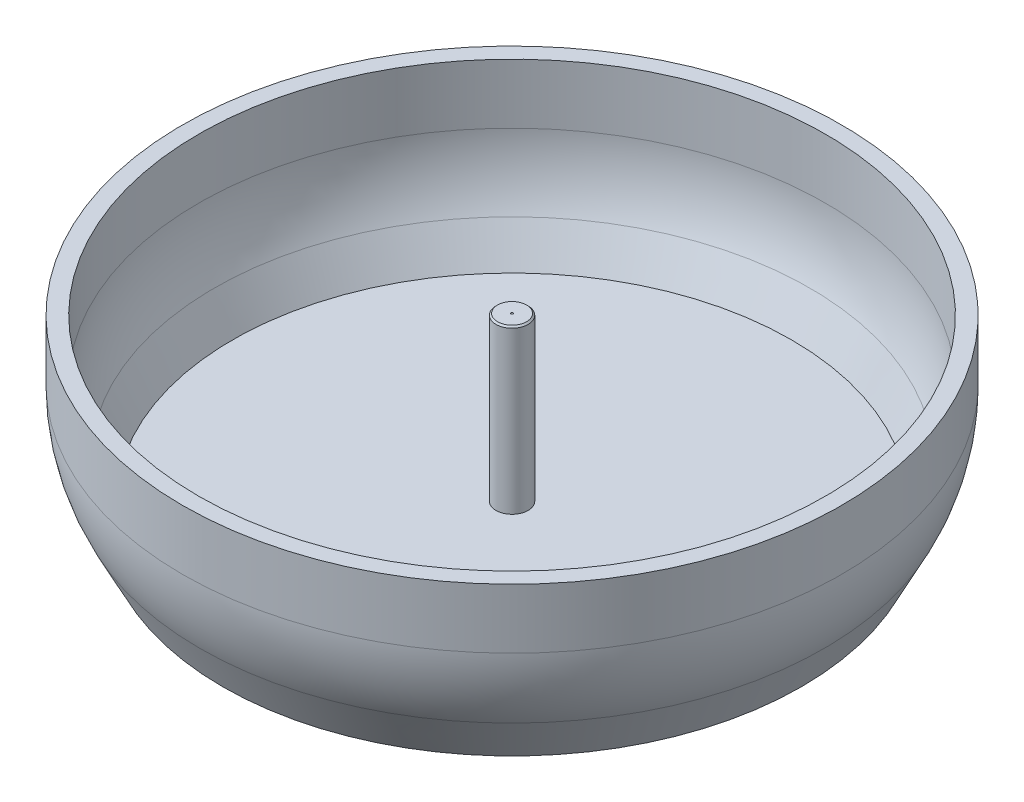
ISO-10303-21;
HEADER;
FILE_DESCRIPTION(('STEP AP214'),'2;1');
FILE_NAME('part.step','',(''),(''),'','','');
FILE_SCHEMA(('AUTOMOTIVE_DESIGN { 1 0 10303 214 1 1 1 1 }'));
ENDSEC;
DATA;
#1=APPLICATION_CONTEXT('core data for automotive mechanical design processes');
#2=APPLICATION_PROTOCOL_DEFINITION('international standard','automotive_design',2000,#1);
#3=PRODUCT_CONTEXT('',#1,'mechanical');
#4=PRODUCT('Part','Part','',(#3));
#5=PRODUCT_RELATED_PRODUCT_CATEGORY('part','',(#4));
#6=PRODUCT_DEFINITION_FORMATION('','',#4);
#7=PRODUCT_DEFINITION_CONTEXT('part definition',#1,'design');
#8=PRODUCT_DEFINITION('design','',#6,#7);
#9=PRODUCT_DEFINITION_SHAPE('','',#8);
#10=(LENGTH_UNIT() NAMED_UNIT(*) SI_UNIT(.MILLI.,.METRE.));
#11=(NAMED_UNIT(*) PLANE_ANGLE_UNIT() SI_UNIT($,.RADIAN.));
#12=(NAMED_UNIT(*) SI_UNIT($,.STERADIAN.) SOLID_ANGLE_UNIT());
#13=UNCERTAINTY_MEASURE_WITH_UNIT(LENGTH_MEASURE(1.E-05),#10,'distance_accuracy_value','');
#14=(GEOMETRIC_REPRESENTATION_CONTEXT(3) GLOBAL_UNCERTAINTY_ASSIGNED_CONTEXT((#13)) GLOBAL_UNIT_ASSIGNED_CONTEXT((#10,
#11,#12)) REPRESENTATION_CONTEXT('',''));
#15=CARTESIAN_POINT('',(0.,0.,0.));
#16=DIRECTION('',(0.,0.,1.));
#17=DIRECTION('',(1.,0.,0.));
#18=AXIS2_PLACEMENT_3D('',#15,#16,#17);
#19=CARTESIAN_POINT('',(0.,0.,0.));
#20=DIRECTION('',(0.,1.,0.));
#21=DIRECTION('',(0.,0.,1.));
#22=AXIS2_PLACEMENT_3D('',#19,#20,#21);
#23=PLANE('',#22);
#24=CARTESIAN_POINT('',(0.,0.,0.));
#25=DIRECTION('',(0.,1.,0.));
#26=DIRECTION('',(0.,0.,1.));
#27=AXIS2_PLACEMENT_3D('',#24,#25,#26);
#28=CIRCLE('',#27,90.1231018894071);
#29=CARTESIAN_POINT('',(0.,0.,90.1231018894071));
#30=VERTEX_POINT('',#29);
#31=EDGE_CURVE('E11',#30,#30,#28,.T.);
#32=ORIENTED_EDGE('',*,*,#31,.F.);
#33=EDGE_LOOP('',(#32));
#34=FACE_BOUND('',#33,.T.);
#35=ADVANCED_FACE('F35',(#34),#23,.F.);
#36=CARTESIAN_POINT('',(0.,0.,0.));
#37=DIRECTION('',(0.,1.,0.));
#38=DIRECTION('',(0.,0.,1.));
#39=AXIS2_PLACEMENT_3D('',#36,#37,#38);
#40=CONICAL_SURFACE('',#39,90.1231018894071,0.471486232558851);
#41=CARTESIAN_POINT('',(0.,13.872079708305,0.));
#42=DIRECTION('',(0.,1.,0.));
#43=DIRECTION('',(0.,0.,1.));
#44=AXIS2_PLACEMENT_3D('',#41,#42,#43);
#45=CIRCLE('',#44,97.1956018817854);
#46=CARTESIAN_POINT('',(0.,13.872079708305,97.1956018817854));
#47=VERTEX_POINT('',#46);
#48=EDGE_CURVE('E41',#47,#47,#45,.T.);
#49=ORIENTED_EDGE('',*,*,#48,.F.);
#50=EDGE_LOOP('',(#49));
#51=FACE_BOUND('',#50,.T.);
#52=ORIENTED_EDGE('',*,*,#31,.T.);
#53=EDGE_LOOP('',(#52));
#54=FACE_BOUND('',#53,.T.);
#55=ADVANCED_FACE('F86',(#51,#54),#40,.T.);
#56=CARTESIAN_POINT('',(0.,36.5826228344215,0.));
#57=DIRECTION('',(0.,1.,0.));
#58=DIRECTION('',(0.,0.,1.));
#59=AXIS2_PLACEMENT_3D('',#56,#57,#58);
#60=TOROIDAL_SURFACE('',#59,52.6508914111043,50.);
#61=CARTESIAN_POINT('',(0.,36.5826228344217,0.));
#62=DIRECTION('',(0.,1.,0.));
#63=DIRECTION('',(0.,0.,1.));
#64=AXIS2_PLACEMENT_3D('',#61,#62,#63);
#65=CIRCLE('',#64,102.650891411104);
#66=CARTESIAN_POINT('',(0.,36.5826228344217,102.650891411104));
#67=VERTEX_POINT('',#66);
#68=EDGE_CURVE('E79',#67,#67,#65,.T.);
#69=ORIENTED_EDGE('',*,*,#68,.F.);
#70=EDGE_LOOP('',(#69));
#71=FACE_BOUND('',#70,.T.);
#72=ORIENTED_EDGE('',*,*,#48,.T.);
#73=EDGE_LOOP('',(#72));
#74=FACE_BOUND('',#73,.T.);
#75=ADVANCED_FACE('F84',(#71,#74),#60,.T.);
#76=CARTESIAN_POINT('',(0.,55.1956304251787,0.));
#77=DIRECTION('',(0.,1.,0.));
#78=DIRECTION('',(0.,0.,1.));
#79=AXIS2_PLACEMENT_3D('',#76,#77,#78);
#80=CYLINDRICAL_SURFACE('',#79,102.650891411104);
#81=CARTESIAN_POINT('',(0.,55.1956304251787,0.));
#82=DIRECTION('',(0.,1.,0.));
#83=DIRECTION('',(0.,0.,1.));
#84=AXIS2_PLACEMENT_3D('',#81,#82,#83);
#85=CIRCLE('',#84,102.650891411104);
#86=CARTESIAN_POINT('',(0.,55.1956304251787,102.650891411104));
#87=VERTEX_POINT('',#86);
#88=EDGE_CURVE('E76',#87,#87,#85,.T.);
#89=ORIENTED_EDGE('',*,*,#88,.F.);
#90=EDGE_LOOP('',(#89));
#91=FACE_BOUND('',#90,.T.);
#92=ORIENTED_EDGE('',*,*,#68,.T.);
#93=EDGE_LOOP('',(#92));
#94=FACE_BOUND('',#93,.T.);
#95=ADVANCED_FACE('F104',(#91,#94),#80,.T.);
#96=CARTESIAN_POINT('',(97.6508914111043,55.1956304251787,0.));
#97=DIRECTION('',(0.,-1.,0.));
#98=DIRECTION('',(0.,0.,-1.));
#99=AXIS2_PLACEMENT_3D('',#96,#97,#98);
#100=PLANE('',#99);
#101=CARTESIAN_POINT('',(0.,55.1956304251787,0.));
#102=DIRECTION('',(0.,1.,0.));
#103=DIRECTION('',(0.,0.,1.));
#104=AXIS2_PLACEMENT_3D('',#101,#102,#103);
#105=CIRCLE('',#104,97.6508914111043);
#106=CARTESIAN_POINT('',(0.,55.1956304251787,97.6508914111043));
#107=VERTEX_POINT('',#106);
#108=EDGE_CURVE('E73',#107,#107,#105,.T.);
#109=ORIENTED_EDGE('',*,*,#108,.F.);
#110=EDGE_LOOP('',(#109));
#111=FACE_BOUND('',#110,.T.);
#112=ORIENTED_EDGE('',*,*,#88,.T.);
#113=EDGE_LOOP('',(#112));
#114=FACE_BOUND('',#113,.T.);
#115=ADVANCED_FACE('F112',(#111,#114),#100,.F.);
#116=CARTESIAN_POINT('',(0.,55.1956304251787,0.));
#117=DIRECTION('',(0.,1.,0.));
#118=DIRECTION('',(0.,0.,1.));
#119=AXIS2_PLACEMENT_3D('',#116,#117,#118);
#120=CYLINDRICAL_SURFACE('',#119,97.6508914111043);
#121=CARTESIAN_POINT('',(0.,36.5826228344216,0.));
#122=DIRECTION('',(0.,1.,0.));
#123=DIRECTION('',(0.,0.,1.));
#124=AXIS2_PLACEMENT_3D('',#121,#122,#123);
#125=CIRCLE('',#124,97.6508914111043);
#126=CARTESIAN_POINT('',(0.,36.5826228344216,97.6508914111043));
#127=VERTEX_POINT('',#126);
#128=EDGE_CURVE('E70',#127,#127,#125,.T.);
#129=ORIENTED_EDGE('',*,*,#128,.F.);
#130=EDGE_LOOP('',(#129));
#131=FACE_BOUND('',#130,.T.);
#132=ORIENTED_EDGE('',*,*,#108,.T.);
#133=EDGE_LOOP('',(#132));
#134=FACE_BOUND('',#133,.T.);
#135=ADVANCED_FACE('F120',(#131,#134),#120,.F.);
#136=CARTESIAN_POINT('',(0.,36.5826228344215,0.));
#137=DIRECTION('',(0.,1.,0.));
#138=DIRECTION('',(0.,0.,1.));
#139=AXIS2_PLACEMENT_3D('',#136,#137,#138);
#140=TOROIDAL_SURFACE('',#139,52.6508914111043,45.);
#141=CARTESIAN_POINT('',(0.,16.1431340209166,0.));
#142=DIRECTION('',(0.,1.,0.));
#143=DIRECTION('',(0.,0.,1.));
#144=AXIS2_PLACEMENT_3D('',#141,#142,#143);
#145=CIRCLE('',#144,92.7411308347173);
#146=CARTESIAN_POINT('',(0.,16.1431340209166,92.7411308347173));
#147=VERTEX_POINT('',#146);
#148=EDGE_CURVE('E67',#147,#147,#145,.T.);
#149=ORIENTED_EDGE('',*,*,#148,.F.);
#150=EDGE_LOOP('',(#149));
#151=FACE_BOUND('',#150,.T.);
#152=ORIENTED_EDGE('',*,*,#128,.T.);
#153=EDGE_LOOP('',(#152));
#154=FACE_BOUND('',#153,.T.);
#155=ADVANCED_FACE('F128',(#151,#154),#140,.F.);
#156=CARTESIAN_POINT('',(0.,16.1431340209166,0.));
#157=DIRECTION('',(0.,1.,0.));
#158=DIRECTION('',(0.,0.,1.));
#159=AXIS2_PLACEMENT_3D('',#156,#157,#158);
#160=CONICAL_SURFACE('',#159,92.7411308347173,0.471486232558852);
#161=CARTESIAN_POINT('',(0.,5.,0.));
#162=DIRECTION('',(0.,1.,0.));
#163=DIRECTION('',(0.,0.,1.));
#164=AXIS2_PLACEMENT_3D('',#161,#162,#163);
#165=CIRCLE('',#164,87.0599484211805);
#166=CARTESIAN_POINT('',(0.,5.,87.0599484211805));
#167=VERTEX_POINT('',#166);
#168=EDGE_CURVE('E64',#167,#167,#165,.T.);
#169=ORIENTED_EDGE('',*,*,#168,.F.);
#170=EDGE_LOOP('',(#169));
#171=FACE_BOUND('',#170,.T.);
#172=ORIENTED_EDGE('',*,*,#148,.T.);
#173=EDGE_LOOP('',(#172));
#174=FACE_BOUND('',#173,.T.);
#175=ADVANCED_FACE('F136',(#171,#174),#160,.F.);
#176=CARTESIAN_POINT('',(5.,5.,0.));
#177=DIRECTION('',(0.,-1.,0.));
#178=DIRECTION('',(0.,0.,-1.));
#179=AXIS2_PLACEMENT_3D('',#176,#177,#178);
#180=PLANE('',#179);
#181=CARTESIAN_POINT('',(0.,5.,0.));
#182=DIRECTION('',(0.,1.,0.));
#183=DIRECTION('',(0.,0.,1.));
#184=AXIS2_PLACEMENT_3D('',#181,#182,#183);
#185=CIRCLE('',#184,5.);
#186=CARTESIAN_POINT('',(0.,5.,5.));
#187=VERTEX_POINT('',#186);
#188=EDGE_CURVE('E61',#187,#187,#185,.T.);
#189=ORIENTED_EDGE('',*,*,#188,.F.);
#190=EDGE_LOOP('',(#189));
#191=FACE_BOUND('',#190,.T.);
#192=ORIENTED_EDGE('',*,*,#168,.T.);
#193=EDGE_LOOP('',(#192));
#194=FACE_BOUND('',#193,.T.);
#195=ADVANCED_FACE('F144',(#191,#194),#180,.F.);
#196=CARTESIAN_POINT('',(0.,55.1956304251787,0.));
#197=DIRECTION('',(0.,1.,0.));
#198=DIRECTION('',(0.,0.,1.));
#199=AXIS2_PLACEMENT_3D('',#196,#197,#198);
#200=CYLINDRICAL_SURFACE('',#199,5.);
#201=CARTESIAN_POINT('',(0.,55.1956304251787,0.));
#202=DIRECTION('',(0.,1.,0.));
#203=DIRECTION('',(0.,0.,1.));
#204=AXIS2_PLACEMENT_3D('',#201,#202,#203);
#205=CIRCLE('',#204,5.);
#206=CARTESIAN_POINT('',(0.,55.1956304251787,5.));
#207=VERTEX_POINT('',#206);
#208=EDGE_CURVE('E56',#207,#207,#205,.T.);
#209=ORIENTED_EDGE('',*,*,#208,.F.);
#210=EDGE_LOOP('',(#209));
#211=FACE_BOUND('',#210,.T.);
#212=ORIENTED_EDGE('',*,*,#188,.T.);
#213=EDGE_LOOP('',(#212));
#214=FACE_BOUND('',#213,.T.);
#215=ADVANCED_FACE('F152',(#211,#214),#200,.T.);
#216=CARTESIAN_POINT('',(0.,55.1956304251787,0.));
#217=DIRECTION('',(0.,-1.,0.));
#218=DIRECTION('',(0.,0.,-1.));
#219=AXIS2_PLACEMENT_3D('',#216,#217,#218);
#220=CONICAL_SURFACE('',#219,5.,0.785398163397452);
#221=CARTESIAN_POINT('',(0.,55.6773599882519,0.));
#222=DIRECTION('',(0.,1.,0.));
#223=DIRECTION('',(0.,0.,1.));
#224=AXIS2_PLACEMENT_3D('',#221,#222,#223);
#225=CIRCLE('',#224,4.51827043692678);
#226=CARTESIAN_POINT('',(0.,55.6773599882519,4.51827043692678));
#227=VERTEX_POINT('',#226);
#228=EDGE_CURVE('E53',#227,#227,#225,.T.);
#229=ORIENTED_EDGE('',*,*,#228,.F.);
#230=EDGE_LOOP('',(#229));
#231=FACE_BOUND('',#230,.T.);
#232=ORIENTED_EDGE('',*,*,#208,.T.);
#233=EDGE_LOOP('',(#232));
#234=FACE_BOUND('',#233,.T.);
#235=ADVANCED_FACE('F160',(#231,#234),#220,.T.);
#236=CARTESIAN_POINT('',(4.51827043692678,55.6773599882519,0.));
#237=DIRECTION('',(0.,-1.,0.));
#238=DIRECTION('',(0.,0.,-1.));
#239=AXIS2_PLACEMENT_3D('',#236,#237,#238);
#240=PLANE('',#239);
#241=CARTESIAN_POINT('',(0.,55.6773599882519,0.));
#242=DIRECTION('',(0.,1.,0.));
#243=DIRECTION('',(0.,0.,1.));
#244=AXIS2_PLACEMENT_3D('',#241,#242,#243);
#245=CIRCLE('',#244,0.335866273348594);
#246=CARTESIAN_POINT('',(0.,55.6773599882519,0.335866273348594));
#247=VERTEX_POINT('',#246);
#248=EDGE_CURVE('E51',#247,#247,#245,.T.);
#249=ORIENTED_EDGE('',*,*,#248,.F.);
#250=EDGE_LOOP('',(#249));
#251=FACE_BOUND('',#250,.T.);
#252=ORIENTED_EDGE('',*,*,#228,.T.);
#253=EDGE_LOOP('',(#252));
#254=FACE_BOUND('',#253,.T.);
#255=ADVANCED_FACE('F47',(#251,#254),#240,.F.);
#256=CARTESIAN_POINT('',(0.,55.6773599882519,0.));
#257=DIRECTION('',(0.,1.,0.));
#258=DIRECTION('',(0.,0.,1.));
#259=AXIS2_PLACEMENT_3D('',#256,#257,#258);
#260=CONICAL_SURFACE('',#259,0.335866273348594,0.608850473604941);
#261=CARTESIAN_POINT('',(0.,55.1956304251787,0.));
#262=VERTEX_POINT('',#261);
#263=VERTEX_LOOP('',#262);
#264=FACE_BOUND('',#263,.T.);
#265=ORIENTED_EDGE('',*,*,#248,.T.);
#266=EDGE_LOOP('',(#265));
#267=FACE_BOUND('',#266,.T.);
#268=ADVANCED_FACE('F44',(#264,#267),#260,.F.);
#269=CLOSED_SHELL('',(#35,#55,#75,#95,#115,#135,#155,#175,#195,#215,#235,#255,#268));
#270=MANIFOLD_SOLID_BREP('B2',#269);
#271=ADVANCED_BREP_SHAPE_REPRESENTATION('',(#18,#270),#14);
#272=SHAPE_DEFINITION_REPRESENTATION(#9,#271);
ENDSEC;
END-ISO-10303-21;
